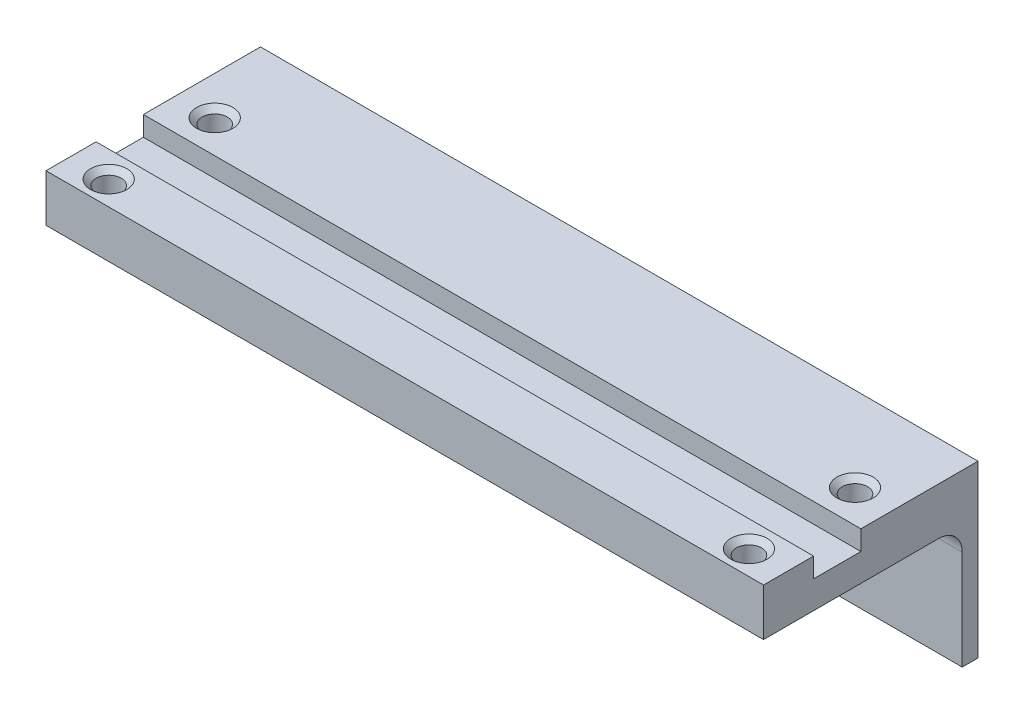
ISO-10303-21;
HEADER;
FILE_DESCRIPTION(('STEP AP214'),'2;1');
FILE_NAME('part.step','',(''),(''),'','','');
FILE_SCHEMA(('AUTOMOTIVE_DESIGN { 1 0 10303 214 1 1 1 1 }'));
ENDSEC;
DATA;
#1=APPLICATION_CONTEXT('core data for automotive mechanical design processes');
#2=APPLICATION_PROTOCOL_DEFINITION('international standard','automotive_design',2000,#1);
#3=PRODUCT_CONTEXT('',#1,'mechanical');
#4=PRODUCT('Part','Part','',(#3));
#5=PRODUCT_RELATED_PRODUCT_CATEGORY('part','',(#4));
#6=PRODUCT_DEFINITION_FORMATION('','',#4);
#7=PRODUCT_DEFINITION_CONTEXT('part definition',#1,'design');
#8=PRODUCT_DEFINITION('design','',#6,#7);
#9=PRODUCT_DEFINITION_SHAPE('','',#8);
#10=(LENGTH_UNIT() NAMED_UNIT(*) SI_UNIT(.MILLI.,.METRE.));
#11=(NAMED_UNIT(*) PLANE_ANGLE_UNIT() SI_UNIT($,.RADIAN.));
#12=(NAMED_UNIT(*) SI_UNIT($,.STERADIAN.) SOLID_ANGLE_UNIT());
#13=UNCERTAINTY_MEASURE_WITH_UNIT(LENGTH_MEASURE(1.E-05),#10,'distance_accuracy_value','');
#14=(GEOMETRIC_REPRESENTATION_CONTEXT(3) GLOBAL_UNCERTAINTY_ASSIGNED_CONTEXT((#13)) GLOBAL_UNIT_ASSIGNED_CONTEXT((#10,
#11,#12)) REPRESENTATION_CONTEXT('',''));
#15=CARTESIAN_POINT('',(0.,0.,0.));
#16=DIRECTION('',(0.,0.,1.));
#17=DIRECTION('',(1.,0.,0.));
#18=AXIS2_PLACEMENT_3D('',#15,#16,#17);
#19=CARTESIAN_POINT('',(0.,4.,0.));
#20=DIRECTION('',(0.,1.,0.));
#21=DIRECTION('',(0.,0.,1.));
#22=AXIS2_PLACEMENT_3D('',#19,#20,#21);
#23=PLANE('',#22);
#24=CARTESIAN_POINT('',(-40.6,4.,-3.5));
#25=DIRECTION('',(0.,1.,0.));
#26=DIRECTION('',(0.,0.,1.));
#27=AXIS2_PLACEMENT_3D('',#24,#25,#26);
#28=CIRCLE('',#27,2.29999999999998);
#29=CARTESIAN_POINT('',(-40.6,4.,-1.20000000000002));
#30=VERTEX_POINT('',#29);
#31=EDGE_CURVE('E255',#30,#30,#28,.F.);
#32=ORIENTED_EDGE('',*,*,#31,.T.);
#33=EDGE_LOOP('',(#32));
#34=FACE_BOUND('',#33,.T.);
#35=CARTESIAN_POINT('',(40.6,4.,-3.5));
#36=DIRECTION('',(0.,1.,0.));
#37=DIRECTION('',(0.,0.,1.));
#38=AXIS2_PLACEMENT_3D('',#35,#36,#37);
#39=CIRCLE('',#38,2.29999999999998);
#40=CARTESIAN_POINT('',(40.6,4.,-1.20000000000002));
#41=VERTEX_POINT('',#40);
#42=EDGE_CURVE('E252',#41,#41,#39,.F.);
#43=ORIENTED_EDGE('',*,*,#42,.T.);
#44=EDGE_LOOP('',(#43));
#45=FACE_BOUND('',#44,.T.);
#46=DIRECTION('',(0.,0.,1.));
#47=VECTOR('',#46,1.);
#48=CARTESIAN_POINT('',(-45.5,4.,-12.));
#49=LINE('',#48,#47);
#50=CARTESIAN_POINT('',(-45.5,4.,-14.2));
#51=VERTEX_POINT('',#50);
#52=CARTESIAN_POINT('',(-45.5,4.,0.65));
#53=VERTEX_POINT('',#52);
#54=EDGE_CURVE('E237',#51,#53,#49,.T.);
#55=ORIENTED_EDGE('',*,*,#54,.T.);
#56=DIRECTION('',(1.,0.,0.));
#57=VECTOR('',#56,1.);
#58=CARTESIAN_POINT('',(-45.5,4.,0.65));
#59=LINE('',#58,#57);
#60=CARTESIAN_POINT('',(45.5,4.,0.650000000000001));
#61=VERTEX_POINT('',#60);
#62=EDGE_CURVE('E211',#53,#61,#59,.T.);
#63=ORIENTED_EDGE('',*,*,#62,.T.);
#64=DIRECTION('',(0.,0.,-1.));
#65=VECTOR('',#64,1.);
#66=CARTESIAN_POINT('',(45.5,4.,-12.));
#67=LINE('',#66,#65);
#68=CARTESIAN_POINT('',(45.5,4.,-14.2));
#69=VERTEX_POINT('',#68);
#70=EDGE_CURVE('E225',#61,#69,#67,.T.);
#71=ORIENTED_EDGE('',*,*,#70,.T.);
#72=DIRECTION('',(1.,0.,0.));
#73=VECTOR('',#72,1.);
#74=CARTESIAN_POINT('',(45.5,4.,-14.2));
#75=LINE('',#74,#73);
#76=EDGE_CURVE('E203',#51,#69,#75,.T.);
#77=ORIENTED_EDGE('',*,*,#76,.F.);
#78=EDGE_LOOP('',(#55,#63,#71,#77));
#79=FACE_BOUND('',#78,.T.);
#80=ADVANCED_FACE('F41',(#34,#45,#79),#23,.T.);
#81=CARTESIAN_POINT('',(45.5,4.,-12.));
#82=DIRECTION('',(-1.,0.,0.));
#83=DIRECTION('',(0.,0.,1.));
#84=AXIS2_PLACEMENT_3D('',#81,#82,#83);
#85=PLANE('',#84);
#86=DIRECTION('',(0.,0.,1.));
#87=VECTOR('',#86,1.);
#88=CARTESIAN_POINT('',(45.5,1.5,0.65));
#89=LINE('',#88,#87);
#90=CARTESIAN_POINT('',(45.5,1.5,0.65));
#91=VERTEX_POINT('',#90);
#92=CARTESIAN_POINT('',(45.5,1.5,6.65));
#93=VERTEX_POINT('',#92);
#94=EDGE_CURVE('E210',#91,#93,#89,.T.);
#95=ORIENTED_EDGE('',*,*,#94,.T.);
#96=DIRECTION('',(0.,1.,0.));
#97=VECTOR('',#96,1.);
#98=CARTESIAN_POINT('',(45.5,1.5,6.65));
#99=LINE('',#98,#97);
#100=CARTESIAN_POINT('',(45.5,4.,6.65));
#101=VERTEX_POINT('',#100);
#102=EDGE_CURVE('E219',#93,#101,#99,.T.);
#103=ORIENTED_EDGE('',*,*,#102,.T.);
#104=CARTESIAN_POINT('',(45.5,4.,13.));
#105=VERTEX_POINT('',#104);
#106=EDGE_CURVE('E233',#105,#101,#67,.T.);
#107=ORIENTED_EDGE('',*,*,#106,.F.);
#108=DIRECTION('',(0.,1.,0.));
#109=VECTOR('',#108,1.);
#110=CARTESIAN_POINT('',(45.5,-2.,13.));
#111=LINE('',#110,#109);
#112=CARTESIAN_POINT('',(45.5,-2.,13.));
#113=VERTEX_POINT('',#112);
#114=EDGE_CURVE('E144',#113,#105,#111,.T.);
#115=ORIENTED_EDGE('',*,*,#114,.F.);
#116=DIRECTION('',(0.,0.,1.));
#117=VECTOR('',#116,1.);
#118=CARTESIAN_POINT('',(45.5,-2.,-12.2));
#119=LINE('',#118,#117);
#120=CARTESIAN_POINT('',(45.5,-2.,-9.2));
#121=VERTEX_POINT('',#120);
#122=EDGE_CURVE('E134',#121,#113,#119,.T.);
#123=ORIENTED_EDGE('',*,*,#122,.F.);
#124=CARTESIAN_POINT('',(45.5,-5.,-9.2));
#125=DIRECTION('',(-1.,0.,0.));
#126=DIRECTION('',(0.,0.,1.));
#127=AXIS2_PLACEMENT_3D('',#124,#125,#126);
#128=CIRCLE('',#127,3.);
#129=CARTESIAN_POINT('',(45.5,-5.,-12.2));
#130=VERTEX_POINT('',#129);
#131=EDGE_CURVE('E49',#121,#130,#128,.T.);
#132=ORIENTED_EDGE('',*,*,#131,.T.);
#133=DIRECTION('',(0.,1.,0.));
#134=VECTOR('',#133,1.);
#135=CARTESIAN_POINT('',(45.5,-17.62,-12.2));
#136=LINE('',#135,#134);
#137=CARTESIAN_POINT('',(45.5,-17.62,-12.2));
#138=VERTEX_POINT('',#137);
#139=EDGE_CURVE('E196',#138,#130,#136,.T.);
#140=ORIENTED_EDGE('',*,*,#139,.F.);
#141=DIRECTION('',(0.,0.,1.));
#142=VECTOR('',#141,1.);
#143=CARTESIAN_POINT('',(45.5,-17.62,-14.2));
#144=LINE('',#143,#142);
#145=CARTESIAN_POINT('',(45.5,-17.62,-14.2));
#146=VERTEX_POINT('',#145);
#147=EDGE_CURVE('E190',#146,#138,#144,.T.);
#148=ORIENTED_EDGE('',*,*,#147,.F.);
#149=DIRECTION('',(0.,-1.,0.));
#150=VECTOR('',#149,1.);
#151=CARTESIAN_POINT('',(45.5,4.,-14.2));
#152=LINE('',#151,#150);
#153=EDGE_CURVE('E198',#69,#146,#152,.T.);
#154=ORIENTED_EDGE('',*,*,#153,.F.);
#155=ORIENTED_EDGE('',*,*,#70,.F.);
#156=DIRECTION('',(0.,1.,0.));
#157=VECTOR('',#156,1.);
#158=CARTESIAN_POINT('',(45.5,1.5,0.65));
#159=LINE('',#158,#157);
#160=EDGE_CURVE('E229',#91,#61,#159,.T.);
#161=ORIENTED_EDGE('',*,*,#160,.F.);
#162=EDGE_LOOP('',(#95,#103,#107,#115,#123,#132,#140,#148,#154,#155,#161));
#163=FACE_BOUND('',#162,.T.);
#164=ADVANCED_FACE('F267',(#163),#85,.F.);
#165=CARTESIAN_POINT('',(-45.5,4.,-12.));
#166=DIRECTION('',(1.,0.,0.));
#167=DIRECTION('',(0.,0.,-1.));
#168=AXIS2_PLACEMENT_3D('',#165,#166,#167);
#169=PLANE('',#168);
#170=DIRECTION('',(0.,0.,-1.));
#171=VECTOR('',#170,1.);
#172=CARTESIAN_POINT('',(-45.5,-2.,12.));
#173=LINE('',#172,#171);
#174=CARTESIAN_POINT('',(-45.5,-2.,13.));
#175=VERTEX_POINT('',#174);
#176=CARTESIAN_POINT('',(-45.5,-2.,-9.2));
#177=VERTEX_POINT('',#176);
#178=EDGE_CURVE('E124',#175,#177,#173,.T.);
#179=ORIENTED_EDGE('',*,*,#178,.F.);
#180=DIRECTION('',(0.,-1.,0.));
#181=VECTOR('',#180,1.);
#182=CARTESIAN_POINT('',(-45.5,4.,13.));
#183=LINE('',#182,#181);
#184=CARTESIAN_POINT('',(-45.5,4.,13.));
#185=VERTEX_POINT('',#184);
#186=EDGE_CURVE('E129',#185,#175,#183,.T.);
#187=ORIENTED_EDGE('',*,*,#186,.F.);
#188=CARTESIAN_POINT('',(-45.5,4.,6.65));
#189=VERTEX_POINT('',#188);
#190=EDGE_CURVE('E236',#189,#185,#49,.T.);
#191=ORIENTED_EDGE('',*,*,#190,.F.);
#192=DIRECTION('',(0.,1.,0.));
#193=VECTOR('',#192,1.);
#194=CARTESIAN_POINT('',(-45.5,1.5,6.65));
#195=LINE('',#194,#193);
#196=CARTESIAN_POINT('',(-45.5,1.5,6.65));
#197=VERTEX_POINT('',#196);
#198=EDGE_CURVE('E223',#197,#189,#195,.T.);
#199=ORIENTED_EDGE('',*,*,#198,.F.);
#200=DIRECTION('',(0.,0.,1.));
#201=VECTOR('',#200,1.);
#202=CARTESIAN_POINT('',(-45.5,1.5,0.65));
#203=LINE('',#202,#201);
#204=CARTESIAN_POINT('',(-45.5,1.5,0.65));
#205=VERTEX_POINT('',#204);
#206=EDGE_CURVE('E216',#205,#197,#203,.T.);
#207=ORIENTED_EDGE('',*,*,#206,.F.);
#208=DIRECTION('',(0.,1.,0.));
#209=VECTOR('',#208,1.);
#210=CARTESIAN_POINT('',(-45.5,1.5,0.65));
#211=LINE('',#210,#209);
#212=EDGE_CURVE('E226',#205,#53,#211,.T.);
#213=ORIENTED_EDGE('',*,*,#212,.T.);
#214=ORIENTED_EDGE('',*,*,#54,.F.);
#215=DIRECTION('',(0.,1.,0.));
#216=VECTOR('',#215,1.);
#217=CARTESIAN_POINT('',(-45.5,4.,-14.2));
#218=LINE('',#217,#216);
#219=CARTESIAN_POINT('',(-45.5,-17.62,-14.2));
#220=VERTEX_POINT('',#219);
#221=EDGE_CURVE('E200',#220,#51,#218,.T.);
#222=ORIENTED_EDGE('',*,*,#221,.F.);
#223=DIRECTION('',(0.,0.,-1.));
#224=VECTOR('',#223,1.);
#225=CARTESIAN_POINT('',(-45.5,-17.62,-14.2));
#226=LINE('',#225,#224);
#227=CARTESIAN_POINT('',(-45.5,-17.62,-12.2));
#228=VERTEX_POINT('',#227);
#229=EDGE_CURVE('E170',#228,#220,#226,.T.);
#230=ORIENTED_EDGE('',*,*,#229,.F.);
#231=DIRECTION('',(0.,1.,0.));
#232=VECTOR('',#231,1.);
#233=CARTESIAN_POINT('',(-45.5,-17.62,-12.2));
#234=LINE('',#233,#232);
#235=CARTESIAN_POINT('',(-45.5,-5.,-12.2));
#236=VERTEX_POINT('',#235);
#237=EDGE_CURVE('E194',#228,#236,#234,.T.);
#238=ORIENTED_EDGE('',*,*,#237,.T.);
#239=CARTESIAN_POINT('',(-45.5,-5.,-9.2));
#240=DIRECTION('',(1.,0.,0.));
#241=DIRECTION('',(0.,0.,-1.));
#242=AXIS2_PLACEMENT_3D('',#239,#240,#241);
#243=CIRCLE('',#242,3.);
#244=EDGE_CURVE('E11',#236,#177,#243,.T.);
#245=ORIENTED_EDGE('',*,*,#244,.T.);
#246=EDGE_LOOP('',(#179,#187,#191,#199,#207,#213,#214,#222,#230,#238,#245));
#247=FACE_BOUND('',#246,.T.);
#248=ADVANCED_FACE('F126',(#247),#169,.F.);
#249=CARTESIAN_POINT('',(-40.6,4.,9.95));
#250=DIRECTION('',(0.,1.,0.));
#251=DIRECTION('',(0.,0.,1.));
#252=AXIS2_PLACEMENT_3D('',#249,#250,#251);
#253=CIRCLE('',#252,2.29999999999998);
#254=CARTESIAN_POINT('',(-40.6,4.,12.25));
#255=VERTEX_POINT('',#254);
#256=EDGE_CURVE('E246',#255,#255,#253,.F.);
#257=ORIENTED_EDGE('',*,*,#256,.T.);
#258=EDGE_LOOP('',(#257));
#259=FACE_BOUND('',#258,.T.);
#260=CARTESIAN_POINT('',(40.6,4.,9.95));
#261=DIRECTION('',(0.,1.,0.));
#262=DIRECTION('',(0.,0.,1.));
#263=AXIS2_PLACEMENT_3D('',#260,#261,#262);
#264=CIRCLE('',#263,2.29999999999998);
#265=CARTESIAN_POINT('',(40.6,4.,12.25));
#266=VERTEX_POINT('',#265);
#267=EDGE_CURVE('E243',#266,#266,#264,.F.);
#268=ORIENTED_EDGE('',*,*,#267,.T.);
#269=EDGE_LOOP('',(#268));
#270=FACE_BOUND('',#269,.T.);
#271=DIRECTION('',(1.,0.,0.));
#272=VECTOR('',#271,1.);
#273=CARTESIAN_POINT('',(-45.5,4.,6.65));
#274=LINE('',#273,#272);
#275=EDGE_CURVE('E206',#189,#101,#274,.T.);
#276=ORIENTED_EDGE('',*,*,#275,.F.);
#277=ORIENTED_EDGE('',*,*,#190,.T.);
#278=DIRECTION('',(-1.,0.,0.));
#279=VECTOR('',#278,1.);
#280=CARTESIAN_POINT('',(45.5,4.,13.));
#281=LINE('',#280,#279);
#282=EDGE_CURVE('E149',#105,#185,#281,.T.);
#283=ORIENTED_EDGE('',*,*,#282,.F.);
#284=ORIENTED_EDGE('',*,*,#106,.T.);
#285=EDGE_LOOP('',(#276,#277,#283,#284));
#286=FACE_BOUND('',#285,.T.);
#287=ADVANCED_FACE('F270',(#259,#270,#286),#23,.T.);
#288=CARTESIAN_POINT('',(-40.6,0.,9.95));
#289=DIRECTION('',(0.,1.,0.));
#290=DIRECTION('',(0.,0.,1.));
#291=AXIS2_PLACEMENT_3D('',#288,#289,#290);
#292=CYLINDRICAL_SURFACE('',#291,1.6);
#293=CARTESIAN_POINT('',(-40.6,3.30000000000002,9.95));
#294=DIRECTION('',(0.,1.,0.));
#295=DIRECTION('',(0.,0.,1.));
#296=AXIS2_PLACEMENT_3D('',#293,#294,#295);
#297=CIRCLE('',#296,1.6);
#298=CARTESIAN_POINT('',(-40.6,3.30000000000002,11.55));
#299=VERTEX_POINT('',#298);
#300=EDGE_CURVE('E240',#299,#299,#297,.T.);
#301=ORIENTED_EDGE('',*,*,#300,.T.);
#302=EDGE_LOOP('',(#301));
#303=FACE_BOUND('',#302,.T.);
#304=CARTESIAN_POINT('',(-40.6,-2.,9.95));
#305=DIRECTION('',(0.,-1.,0.));
#306=DIRECTION('',(0.,0.,-1.));
#307=AXIS2_PLACEMENT_3D('',#304,#305,#306);
#308=CIRCLE('',#307,1.6);
#309=CARTESIAN_POINT('',(-40.6,-2.,8.35));
#310=VERTEX_POINT('',#309);
#311=EDGE_CURVE('E154',#310,#310,#308,.T.);
#312=ORIENTED_EDGE('',*,*,#311,.T.);
#313=EDGE_LOOP('',(#312));
#314=FACE_BOUND('',#313,.T.);
#315=ADVANCED_FACE('F314',(#303,#314),#292,.F.);
#316=CARTESIAN_POINT('',(40.6,0.,-3.5));
#317=DIRECTION('',(0.,1.,0.));
#318=DIRECTION('',(0.,0.,1.));
#319=AXIS2_PLACEMENT_3D('',#316,#317,#318);
#320=CYLINDRICAL_SURFACE('',#319,1.6);
#321=CARTESIAN_POINT('',(40.6,3.30000000000002,-3.5));
#322=DIRECTION('',(0.,1.,0.));
#323=DIRECTION('',(0.,0.,1.));
#324=AXIS2_PLACEMENT_3D('',#321,#322,#323);
#325=CIRCLE('',#324,1.6);
#326=CARTESIAN_POINT('',(40.6,3.30000000000002,-1.9));
#327=VERTEX_POINT('',#326);
#328=EDGE_CURVE('E258',#327,#327,#325,.T.);
#329=ORIENTED_EDGE('',*,*,#328,.T.);
#330=EDGE_LOOP('',(#329));
#331=FACE_BOUND('',#330,.T.);
#332=CARTESIAN_POINT('',(40.6,-2.,-3.5));
#333=DIRECTION('',(0.,-1.,0.));
#334=DIRECTION('',(0.,0.,-1.));
#335=AXIS2_PLACEMENT_3D('',#332,#333,#334);
#336=CIRCLE('',#335,1.6);
#337=CARTESIAN_POINT('',(40.6,-2.,-5.1));
#338=VERTEX_POINT('',#337);
#339=EDGE_CURVE('E160',#338,#338,#336,.T.);
#340=ORIENTED_EDGE('',*,*,#339,.T.);
#341=EDGE_LOOP('',(#340));
#342=FACE_BOUND('',#341,.T.);
#343=ADVANCED_FACE('F319',(#331,#342),#320,.F.);
#344=CARTESIAN_POINT('',(-40.6,0.,-3.5));
#345=DIRECTION('',(0.,1.,0.));
#346=DIRECTION('',(0.,0.,1.));
#347=AXIS2_PLACEMENT_3D('',#344,#345,#346);
#348=CYLINDRICAL_SURFACE('',#347,1.6);
#349=CARTESIAN_POINT('',(-40.6,3.30000000000002,-3.5));
#350=DIRECTION('',(0.,1.,0.));
#351=DIRECTION('',(0.,0.,1.));
#352=AXIS2_PLACEMENT_3D('',#349,#350,#351);
#353=CIRCLE('',#352,1.6);
#354=CARTESIAN_POINT('',(-40.6,3.30000000000002,-1.9));
#355=VERTEX_POINT('',#354);
#356=EDGE_CURVE('E249',#355,#355,#353,.T.);
#357=ORIENTED_EDGE('',*,*,#356,.T.);
#358=EDGE_LOOP('',(#357));
#359=FACE_BOUND('',#358,.T.);
#360=CARTESIAN_POINT('',(-40.6,-2.,-3.5));
#361=DIRECTION('',(0.,-1.,0.));
#362=DIRECTION('',(0.,0.,-1.));
#363=AXIS2_PLACEMENT_3D('',#360,#361,#362);
#364=CIRCLE('',#363,1.6);
#365=CARTESIAN_POINT('',(-40.6,-2.,-5.1));
#366=VERTEX_POINT('',#365);
#367=EDGE_CURVE('E157',#366,#366,#364,.T.);
#368=ORIENTED_EDGE('',*,*,#367,.T.);
#369=EDGE_LOOP('',(#368));
#370=FACE_BOUND('',#369,.T.);
#371=ADVANCED_FACE('F331',(#359,#370),#348,.F.);
#372=CARTESIAN_POINT('',(40.6,0.,9.95));
#373=DIRECTION('',(0.,1.,0.));
#374=DIRECTION('',(0.,0.,1.));
#375=AXIS2_PLACEMENT_3D('',#372,#373,#374);
#376=CYLINDRICAL_SURFACE('',#375,1.6);
#377=CARTESIAN_POINT('',(40.6,3.30000000000002,9.95));
#378=DIRECTION('',(0.,1.,0.));
#379=DIRECTION('',(0.,0.,1.));
#380=AXIS2_PLACEMENT_3D('',#377,#378,#379);
#381=CIRCLE('',#380,1.6);
#382=CARTESIAN_POINT('',(40.6,3.30000000000002,11.55));
#383=VERTEX_POINT('',#382);
#384=EDGE_CURVE('E261',#383,#383,#381,.T.);
#385=ORIENTED_EDGE('',*,*,#384,.T.);
#386=EDGE_LOOP('',(#385));
#387=FACE_BOUND('',#386,.T.);
#388=CARTESIAN_POINT('',(40.6,-2.,9.95));
#389=DIRECTION('',(0.,-1.,0.));
#390=DIRECTION('',(0.,0.,-1.));
#391=AXIS2_PLACEMENT_3D('',#388,#389,#390);
#392=CIRCLE('',#391,1.6);
#393=CARTESIAN_POINT('',(40.6,-2.,8.35));
#394=VERTEX_POINT('',#393);
#395=EDGE_CURVE('E135',#394,#394,#392,.T.);
#396=ORIENTED_EDGE('',*,*,#395,.T.);
#397=EDGE_LOOP('',(#396));
#398=FACE_BOUND('',#397,.T.);
#399=ADVANCED_FACE('F328',(#387,#398),#376,.F.);
#400=CARTESIAN_POINT('',(-45.5,1.5,6.65));
#401=DIRECTION('',(0.,0.,1.));
#402=DIRECTION('',(1.,0.,0.));
#403=AXIS2_PLACEMENT_3D('',#400,#401,#402);
#404=PLANE('',#403);
#405=ORIENTED_EDGE('',*,*,#275,.T.);
#406=ORIENTED_EDGE('',*,*,#102,.F.);
#407=DIRECTION('',(1.,0.,0.));
#408=VECTOR('',#407,1.);
#409=CARTESIAN_POINT('',(-45.5,1.5,6.65));
#410=LINE('',#409,#408);
#411=EDGE_CURVE('E207',#197,#93,#410,.T.);
#412=ORIENTED_EDGE('',*,*,#411,.F.);
#413=ORIENTED_EDGE('',*,*,#198,.T.);
#414=EDGE_LOOP('',(#405,#406,#412,#413));
#415=FACE_BOUND('',#414,.T.);
#416=ADVANCED_FACE('F274',(#415),#404,.F.);
#417=CARTESIAN_POINT('',(-45.5,1.5,0.65));
#418=DIRECTION('',(0.,0.,1.));
#419=DIRECTION('',(1.,0.,0.));
#420=AXIS2_PLACEMENT_3D('',#417,#418,#419);
#421=PLANE('',#420);
#422=ORIENTED_EDGE('',*,*,#62,.F.);
#423=ORIENTED_EDGE('',*,*,#212,.F.);
#424=DIRECTION('',(1.,0.,0.));
#425=VECTOR('',#424,1.);
#426=CARTESIAN_POINT('',(-45.5,1.5,0.65));
#427=LINE('',#426,#425);
#428=EDGE_CURVE('E214',#205,#91,#427,.T.);
#429=ORIENTED_EDGE('',*,*,#428,.T.);
#430=ORIENTED_EDGE('',*,*,#160,.T.);
#431=EDGE_LOOP('',(#422,#423,#429,#430));
#432=FACE_BOUND('',#431,.T.);
#433=ADVANCED_FACE('F281',(#432),#421,.T.);
#434=CARTESIAN_POINT('',(0.,1.5,0.));
#435=DIRECTION('',(0.,-1.,0.));
#436=DIRECTION('',(0.,0.,-1.));
#437=AXIS2_PLACEMENT_3D('',#434,#435,#436);
#438=PLANE('',#437);
#439=ORIENTED_EDGE('',*,*,#411,.T.);
#440=ORIENTED_EDGE('',*,*,#94,.F.);
#441=ORIENTED_EDGE('',*,*,#428,.F.);
#442=ORIENTED_EDGE('',*,*,#206,.T.);
#443=EDGE_LOOP('',(#439,#440,#441,#442));
#444=FACE_BOUND('',#443,.T.);
#445=ADVANCED_FACE('F278',(#444),#438,.F.);
#446=CARTESIAN_POINT('',(0.,0.,-14.2));
#447=DIRECTION('',(0.,0.,-1.));
#448=DIRECTION('',(-1.,0.,0.));
#449=AXIS2_PLACEMENT_3D('',#446,#447,#448);
#450=PLANE('',#449);
#451=CARTESIAN_POINT('',(-21.25,-10.12,-14.2));
#452=DIRECTION('',(0.,0.,1.));
#453=DIRECTION('',(1.,0.,0.));
#454=AXIS2_PLACEMENT_3D('',#451,#452,#453);
#455=CIRCLE('',#454,1.75);
#456=CARTESIAN_POINT('',(-19.5,-10.12,-14.2));
#457=VERTEX_POINT('',#456);
#458=EDGE_CURVE('E167',#457,#457,#455,.T.);
#459=ORIENTED_EDGE('',*,*,#458,.T.);
#460=EDGE_LOOP('',(#459));
#461=FACE_BOUND('',#460,.T.);
#462=CARTESIAN_POINT('',(0.,-10.12,-14.2));
#463=DIRECTION('',(0.,0.,1.));
#464=DIRECTION('',(1.,0.,0.));
#465=AXIS2_PLACEMENT_3D('',#462,#463,#464);
#466=CIRCLE('',#465,1.75);
#467=CARTESIAN_POINT('',(1.75,-10.12,-14.2));
#468=VERTEX_POINT('',#467);
#469=EDGE_CURVE('E177',#468,#468,#466,.T.);
#470=ORIENTED_EDGE('',*,*,#469,.T.);
#471=EDGE_LOOP('',(#470));
#472=FACE_BOUND('',#471,.T.);
#473=CARTESIAN_POINT('',(21.25,-10.12,-14.2));
#474=DIRECTION('',(0.,0.,1.));
#475=DIRECTION('',(1.,0.,0.));
#476=AXIS2_PLACEMENT_3D('',#473,#474,#475);
#477=CIRCLE('',#476,1.75);
#478=CARTESIAN_POINT('',(23.,-10.12,-14.2));
#479=VERTEX_POINT('',#478);
#480=EDGE_CURVE('E166',#479,#479,#477,.T.);
#481=ORIENTED_EDGE('',*,*,#480,.T.);
#482=EDGE_LOOP('',(#481));
#483=FACE_BOUND('',#482,.T.);
#484=ORIENTED_EDGE('',*,*,#153,.T.);
#485=DIRECTION('',(1.,0.,0.));
#486=VECTOR('',#485,1.);
#487=CARTESIAN_POINT('',(-45.5,-17.62,-14.2));
#488=LINE('',#487,#486);
#489=EDGE_CURVE('E187',#220,#146,#488,.T.);
#490=ORIENTED_EDGE('',*,*,#489,.F.);
#491=ORIENTED_EDGE('',*,*,#221,.T.);
#492=ORIENTED_EDGE('',*,*,#76,.T.);
#493=EDGE_LOOP('',(#484,#490,#491,#492));
#494=FACE_BOUND('',#493,.T.);
#495=ADVANCED_FACE('F287',(#461,#472,#483,#494),#450,.T.);
#496=CARTESIAN_POINT('',(-45.5,-17.62,-12.2));
#497=DIRECTION('',(0.,0.,-1.));
#498=DIRECTION('',(-1.,0.,0.));
#499=AXIS2_PLACEMENT_3D('',#496,#497,#498);
#500=PLANE('',#499);
#501=CARTESIAN_POINT('',(-21.25,-10.12,-12.2));
#502=DIRECTION('',(0.,0.,1.));
#503=DIRECTION('',(1.,0.,0.));
#504=AXIS2_PLACEMENT_3D('',#501,#502,#503);
#505=CIRCLE('',#504,1.75);
#506=CARTESIAN_POINT('',(-19.5,-10.12,-12.2));
#507=VERTEX_POINT('',#506);
#508=EDGE_CURVE('E171',#507,#507,#505,.T.);
#509=ORIENTED_EDGE('',*,*,#508,.F.);
#510=EDGE_LOOP('',(#509));
#511=FACE_BOUND('',#510,.T.);
#512=CARTESIAN_POINT('',(0.,-10.12,-12.2));
#513=DIRECTION('',(0.,0.,1.));
#514=DIRECTION('',(1.,0.,0.));
#515=AXIS2_PLACEMENT_3D('',#512,#513,#514);
#516=CIRCLE('',#515,1.75);
#517=CARTESIAN_POINT('',(1.75,-10.12,-12.2));
#518=VERTEX_POINT('',#517);
#519=EDGE_CURVE('E174',#518,#518,#516,.T.);
#520=ORIENTED_EDGE('',*,*,#519,.F.);
#521=EDGE_LOOP('',(#520));
#522=FACE_BOUND('',#521,.T.);
#523=CARTESIAN_POINT('',(21.25,-10.12,-12.2));
#524=DIRECTION('',(0.,0.,1.));
#525=DIRECTION('',(1.,0.,0.));
#526=AXIS2_PLACEMENT_3D('',#523,#524,#525);
#527=CIRCLE('',#526,1.75);
#528=CARTESIAN_POINT('',(23.,-10.12,-12.2));
#529=VERTEX_POINT('',#528);
#530=EDGE_CURVE('E180',#529,#529,#527,.T.);
#531=ORIENTED_EDGE('',*,*,#530,.F.);
#532=EDGE_LOOP('',(#531));
#533=FACE_BOUND('',#532,.T.);
#534=ORIENTED_EDGE('',*,*,#139,.T.);
#535=DIRECTION('',(1.,0.,0.));
#536=VECTOR('',#535,1.);
#537=CARTESIAN_POINT('',(-45.5,-5.,-12.2));
#538=LINE('',#537,#536);
#539=EDGE_CURVE('E56',#130,#236,#538,.F.);
#540=ORIENTED_EDGE('',*,*,#539,.T.);
#541=ORIENTED_EDGE('',*,*,#237,.F.);
#542=DIRECTION('',(-1.,0.,0.));
#543=VECTOR('',#542,1.);
#544=CARTESIAN_POINT('',(-45.5,-17.62,-12.2));
#545=LINE('',#544,#543);
#546=EDGE_CURVE('E192',#138,#228,#545,.T.);
#547=ORIENTED_EDGE('',*,*,#546,.F.);
#548=EDGE_LOOP('',(#534,#540,#541,#547));
#549=FACE_BOUND('',#548,.T.);
#550=ADVANCED_FACE('F358',(#511,#522,#533,#549),#500,.F.);
#551=CARTESIAN_POINT('',(0.,-17.62,0.));
#552=DIRECTION('',(0.,1.,0.));
#553=DIRECTION('',(0.,0.,1.));
#554=AXIS2_PLACEMENT_3D('',#551,#552,#553);
#555=PLANE('',#554);
#556=ORIENTED_EDGE('',*,*,#229,.T.);
#557=ORIENTED_EDGE('',*,*,#489,.T.);
#558=ORIENTED_EDGE('',*,*,#147,.T.);
#559=ORIENTED_EDGE('',*,*,#546,.T.);
#560=EDGE_LOOP('',(#556,#557,#558,#559));
#561=FACE_BOUND('',#560,.T.);
#562=ADVANCED_FACE('F292',(#561),#555,.F.);
#563=CARTESIAN_POINT('',(21.25,-10.12,-14.2));
#564=DIRECTION('',(0.,0.,1.));
#565=DIRECTION('',(1.,0.,0.));
#566=AXIS2_PLACEMENT_3D('',#563,#564,#565);
#567=CYLINDRICAL_SURFACE('',#566,1.75);
#568=ORIENTED_EDGE('',*,*,#480,.F.);
#569=EDGE_LOOP('',(#568));
#570=FACE_BOUND('',#569,.T.);
#571=ORIENTED_EDGE('',*,*,#530,.T.);
#572=EDGE_LOOP('',(#571));
#573=FACE_BOUND('',#572,.T.);
#574=ADVANCED_FACE('F351',(#570,#573),#567,.F.);
#575=CARTESIAN_POINT('',(0.,-10.12,-14.2));
#576=DIRECTION('',(0.,0.,1.));
#577=DIRECTION('',(1.,0.,0.));
#578=AXIS2_PLACEMENT_3D('',#575,#576,#577);
#579=CYLINDRICAL_SURFACE('',#578,1.75);
#580=ORIENTED_EDGE('',*,*,#469,.F.);
#581=EDGE_LOOP('',(#580));
#582=FACE_BOUND('',#581,.T.);
#583=ORIENTED_EDGE('',*,*,#519,.T.);
#584=EDGE_LOOP('',(#583));
#585=FACE_BOUND('',#584,.T.);
#586=ADVANCED_FACE('F344',(#582,#585),#579,.F.);
#587=CARTESIAN_POINT('',(-21.25,-10.12,-14.2));
#588=DIRECTION('',(0.,0.,1.));
#589=DIRECTION('',(1.,0.,0.));
#590=AXIS2_PLACEMENT_3D('',#587,#588,#589);
#591=CYLINDRICAL_SURFACE('',#590,1.75);
#592=ORIENTED_EDGE('',*,*,#458,.F.);
#593=EDGE_LOOP('',(#592));
#594=FACE_BOUND('',#593,.T.);
#595=ORIENTED_EDGE('',*,*,#508,.T.);
#596=EDGE_LOOP('',(#595));
#597=FACE_BOUND('',#596,.T.);
#598=ADVANCED_FACE('F335',(#594,#597),#591,.F.);
#599=CARTESIAN_POINT('',(0.,-2.,0.));
#600=DIRECTION('',(0.,-1.,0.));
#601=DIRECTION('',(0.,0.,-1.));
#602=AXIS2_PLACEMENT_3D('',#599,#600,#601);
#603=PLANE('',#602);
#604=ORIENTED_EDGE('',*,*,#367,.F.);
#605=EDGE_LOOP('',(#604));
#606=FACE_BOUND('',#605,.T.);
#607=ORIENTED_EDGE('',*,*,#395,.F.);
#608=EDGE_LOOP('',(#607));
#609=FACE_BOUND('',#608,.T.);
#610=ORIENTED_EDGE('',*,*,#178,.T.);
#611=DIRECTION('',(1.,0.,0.));
#612=VECTOR('',#611,1.);
#613=CARTESIAN_POINT('',(0.,-2.,-9.2));
#614=LINE('',#613,#612);
#615=EDGE_CURVE('E264',#177,#121,#614,.T.);
#616=ORIENTED_EDGE('',*,*,#615,.T.);
#617=ORIENTED_EDGE('',*,*,#122,.T.);
#618=DIRECTION('',(1.,0.,0.));
#619=VECTOR('',#618,1.);
#620=CARTESIAN_POINT('',(-45.5,-2.,13.));
#621=LINE('',#620,#619);
#622=EDGE_CURVE('E138',#175,#113,#621,.T.);
#623=ORIENTED_EDGE('',*,*,#622,.F.);
#624=EDGE_LOOP('',(#610,#616,#617,#623));
#625=FACE_BOUND('',#624,.T.);
#626=ORIENTED_EDGE('',*,*,#339,.F.);
#627=EDGE_LOOP('',(#626));
#628=FACE_BOUND('',#627,.T.);
#629=ORIENTED_EDGE('',*,*,#311,.F.);
#630=EDGE_LOOP('',(#629));
#631=FACE_BOUND('',#630,.T.);
#632=ADVANCED_FACE('F139',(#606,#609,#625,#628,#631),#603,.T.);
#633=CARTESIAN_POINT('',(0.,0.,13.));
#634=DIRECTION('',(0.,0.,1.));
#635=DIRECTION('',(1.,0.,0.));
#636=AXIS2_PLACEMENT_3D('',#633,#634,#635);
#637=PLANE('',#636);
#638=ORIENTED_EDGE('',*,*,#186,.T.);
#639=ORIENTED_EDGE('',*,*,#622,.T.);
#640=ORIENTED_EDGE('',*,*,#114,.T.);
#641=ORIENTED_EDGE('',*,*,#282,.T.);
#642=EDGE_LOOP('',(#638,#639,#640,#641));
#643=FACE_BOUND('',#642,.T.);
#644=ADVANCED_FACE('F147',(#643),#637,.T.);
#645=CARTESIAN_POINT('',(-40.6,3.30000000000002,9.95));
#646=DIRECTION('',(0.,1.,0.));
#647=DIRECTION('',(0.,0.,1.));
#648=AXIS2_PLACEMENT_3D('',#645,#646,#647);
#649=CONICAL_SURFACE('',#648,1.6,0.785398163397454);
#650=ORIENTED_EDGE('',*,*,#256,.F.);
#651=EDGE_LOOP('',(#650));
#652=FACE_BOUND('',#651,.T.);
#653=ORIENTED_EDGE('',*,*,#300,.F.);
#654=EDGE_LOOP('',(#653));
#655=FACE_BOUND('',#654,.T.);
#656=ADVANCED_FACE('F341',(#652,#655),#649,.F.);
#657=CARTESIAN_POINT('',(-40.6,3.30000000000002,-3.5));
#658=DIRECTION('',(0.,1.,0.));
#659=DIRECTION('',(0.,0.,1.));
#660=AXIS2_PLACEMENT_3D('',#657,#658,#659);
#661=CONICAL_SURFACE('',#660,1.6,0.785398163397453);
#662=ORIENTED_EDGE('',*,*,#31,.F.);
#663=EDGE_LOOP('',(#662));
#664=FACE_BOUND('',#663,.T.);
#665=ORIENTED_EDGE('',*,*,#356,.F.);
#666=EDGE_LOOP('',(#665));
#667=FACE_BOUND('',#666,.T.);
#668=ADVANCED_FACE('F380',(#664,#667),#661,.F.);
#669=CARTESIAN_POINT('',(40.6,3.30000000000002,-3.5));
#670=DIRECTION('',(0.,1.,0.));
#671=DIRECTION('',(0.,0.,1.));
#672=AXIS2_PLACEMENT_3D('',#669,#670,#671);
#673=CONICAL_SURFACE('',#672,1.6,0.785398163397453);
#674=ORIENTED_EDGE('',*,*,#42,.F.);
#675=EDGE_LOOP('',(#674));
#676=FACE_BOUND('',#675,.T.);
#677=ORIENTED_EDGE('',*,*,#328,.F.);
#678=EDGE_LOOP('',(#677));
#679=FACE_BOUND('',#678,.T.);
#680=ADVANCED_FACE('F300',(#676,#679),#673,.F.);
#681=CARTESIAN_POINT('',(40.6,3.30000000000002,9.95));
#682=DIRECTION('',(0.,1.,0.));
#683=DIRECTION('',(0.,0.,1.));
#684=AXIS2_PLACEMENT_3D('',#681,#682,#683);
#685=CONICAL_SURFACE('',#684,1.6,0.785398163397454);
#686=ORIENTED_EDGE('',*,*,#267,.F.);
#687=EDGE_LOOP('',(#686));
#688=FACE_BOUND('',#687,.T.);
#689=ORIENTED_EDGE('',*,*,#384,.F.);
#690=EDGE_LOOP('',(#689));
#691=FACE_BOUND('',#690,.T.);
#692=ADVANCED_FACE('F295',(#688,#691),#685,.F.);
#693=CARTESIAN_POINT('',(0.,-5.,-9.2));
#694=DIRECTION('',(1.,0.,0.));
#695=DIRECTION('',(0.,0.,-1.));
#696=AXIS2_PLACEMENT_3D('',#693,#694,#695);
#697=CYLINDRICAL_SURFACE('',#696,3.);
#698=ORIENTED_EDGE('',*,*,#244,.F.);
#699=ORIENTED_EDGE('',*,*,#539,.F.);
#700=ORIENTED_EDGE('',*,*,#131,.F.);
#701=ORIENTED_EDGE('',*,*,#615,.F.);
#702=EDGE_LOOP('',(#698,#699,#700,#701));
#703=FACE_BOUND('',#702,.T.);
#704=ADVANCED_FACE('F43',(#703),#697,.F.);
#705=CLOSED_SHELL('',(#80,#164,#248,#287,#315,#343,#371,#399,#416,#433,#445,#495,#550,#562,#574,
#586,#598,#632,#644,#656,#668,#680,#692,#704));
#706=MANIFOLD_SOLID_BREP('B2',#705);
#707=ADVANCED_BREP_SHAPE_REPRESENTATION('',(#18,#706),#14);
#708=SHAPE_DEFINITION_REPRESENTATION(#9,#707);
ENDSEC;
END-ISO-10303-21;
